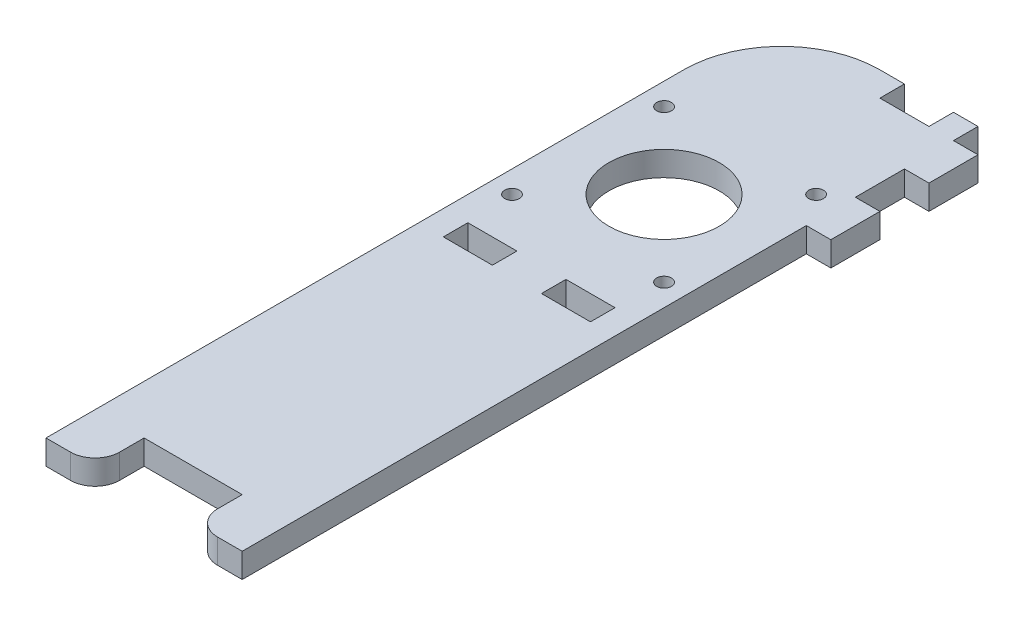
ISO-10303-21;
HEADER;
FILE_DESCRIPTION(('STEP AP214'),'2;1');
FILE_NAME('part.step','',(''),(''),'','','');
FILE_SCHEMA(('AUTOMOTIVE_DESIGN { 1 0 10303 214 1 1 1 1 }'));
ENDSEC;
DATA;
#1=APPLICATION_CONTEXT('core data for automotive mechanical design processes');
#2=APPLICATION_PROTOCOL_DEFINITION('international standard','automotive_design',2000,#1);
#3=PRODUCT_CONTEXT('',#1,'mechanical');
#4=PRODUCT('Part','Part','',(#3));
#5=PRODUCT_RELATED_PRODUCT_CATEGORY('part','',(#4));
#6=PRODUCT_DEFINITION_FORMATION('','',#4);
#7=PRODUCT_DEFINITION_CONTEXT('part definition',#1,'design');
#8=PRODUCT_DEFINITION('design','',#6,#7);
#9=PRODUCT_DEFINITION_SHAPE('','',#8);
#10=(LENGTH_UNIT() NAMED_UNIT(*) SI_UNIT(.MILLI.,.METRE.));
#11=(NAMED_UNIT(*) PLANE_ANGLE_UNIT() SI_UNIT($,.RADIAN.));
#12=(NAMED_UNIT(*) SI_UNIT($,.STERADIAN.) SOLID_ANGLE_UNIT());
#13=UNCERTAINTY_MEASURE_WITH_UNIT(LENGTH_MEASURE(1.E-05),#10,'distance_accuracy_value','');
#14=(GEOMETRIC_REPRESENTATION_CONTEXT(3) GLOBAL_UNCERTAINTY_ASSIGNED_CONTEXT((#13)) GLOBAL_UNIT_ASSIGNED_CONTEXT((#10,
#11,#12)) REPRESENTATION_CONTEXT('',''));
#15=CARTESIAN_POINT('',(0.,0.,0.));
#16=DIRECTION('',(0.,0.,1.));
#17=DIRECTION('',(1.,0.,0.));
#18=AXIS2_PLACEMENT_3D('',#15,#16,#17);
#19=CARTESIAN_POINT('',(20.,5.,-130.));
#20=DIRECTION('',(0.,-1.,0.));
#21=DIRECTION('',(0.,0.,-1.));
#22=AXIS2_PLACEMENT_3D('',#19,#20,#21);
#23=PLANE('',#22);
#24=DIRECTION('',(0.,0.,1.));
#25=VECTOR('',#24,1.);
#26=CARTESIAN_POINT('',(4.99999999999999,5.,-81.));
#27=LINE('',#26,#25);
#28=CARTESIAN_POINT('',(4.99999999999999,5.,-81.));
#29=VERTEX_POINT('',#28);
#30=CARTESIAN_POINT('',(4.99999999999999,5.,-76.));
#31=VERTEX_POINT('',#30);
#32=EDGE_CURVE('E277',#29,#31,#27,.T.);
#33=ORIENTED_EDGE('',*,*,#32,.F.);
#34=DIRECTION('',(-1.,0.,0.));
#35=VECTOR('',#34,1.);
#36=CARTESIAN_POINT('',(4.99999999999999,5.,-81.));
#37=LINE('',#36,#35);
#38=CARTESIAN_POINT('',(15.,5.,-81.));
#39=VERTEX_POINT('',#38);
#40=EDGE_CURVE('E285',#39,#29,#37,.T.);
#41=ORIENTED_EDGE('',*,*,#40,.F.);
#42=DIRECTION('',(0.,0.,-1.));
#43=VECTOR('',#42,1.);
#44=CARTESIAN_POINT('',(15.,5.,-81.));
#45=LINE('',#44,#43);
#46=CARTESIAN_POINT('',(15.,5.,-76.));
#47=VERTEX_POINT('',#46);
#48=EDGE_CURVE('E282',#47,#39,#45,.T.);
#49=ORIENTED_EDGE('',*,*,#48,.F.);
#50=DIRECTION('',(1.,0.,0.));
#51=VECTOR('',#50,1.);
#52=CARTESIAN_POINT('',(4.99999999999999,5.,-76.));
#53=LINE('',#52,#51);
#54=EDGE_CURVE('E279',#31,#47,#53,.T.);
#55=ORIENTED_EDGE('',*,*,#54,.F.);
#56=EDGE_LOOP('',(#33,#41,#49,#55));
#57=FACE_BOUND('',#56,.T.);
#58=DIRECTION('',(0.,0.,1.));
#59=VECTOR('',#58,1.);
#60=CARTESIAN_POINT('',(0.,5.,0.));
#61=LINE('',#60,#59);
#62=CARTESIAN_POINT('',(0.,5.,-130.));
#63=VERTEX_POINT('',#62);
#64=CARTESIAN_POINT('',(0.,5.,0.));
#65=VERTEX_POINT('',#64);
#66=EDGE_CURVE('E308',#63,#65,#61,.T.);
#67=ORIENTED_EDGE('',*,*,#66,.T.);
#68=DIRECTION('',(1.,0.,0.));
#69=VECTOR('',#68,1.);
#70=CARTESIAN_POINT('',(0.,5.,0.));
#71=LINE('',#70,#69);
#72=CARTESIAN_POINT('',(4.99999999999996,5.,0.));
#73=VERTEX_POINT('',#72);
#74=EDGE_CURVE('E311',#65,#73,#71,.T.);
#75=ORIENTED_EDGE('',*,*,#74,.T.);
#76=CARTESIAN_POINT('',(4.99999999999999,5.,-5.00000000000003));
#77=DIRECTION('',(0.,1.,0.));
#78=DIRECTION('',(0.,0.,-1.));
#79=AXIS2_PLACEMENT_3D('',#76,#77,#78);
#80=CIRCLE('',#79,5.);
#81=CARTESIAN_POINT('',(9.99999999999999,5.,-5.00000000000006));
#82=VERTEX_POINT('',#81);
#83=EDGE_CURVE('E314',#73,#82,#80,.T.);
#84=ORIENTED_EDGE('',*,*,#83,.T.);
#85=DIRECTION('',(0.,0.,-1.));
#86=VECTOR('',#85,1.);
#87=CARTESIAN_POINT('',(9.99999999999999,5.,-5.00000000000006));
#88=LINE('',#87,#86);
#89=CARTESIAN_POINT('',(9.99999999999999,5.,-10.));
#90=VERTEX_POINT('',#89);
#91=EDGE_CURVE('E316',#82,#90,#88,.T.);
#92=ORIENTED_EDGE('',*,*,#91,.T.);
#93=DIRECTION('',(1.,0.,0.));
#94=VECTOR('',#93,1.);
#95=CARTESIAN_POINT('',(9.99999999999999,5.,-10.));
#96=LINE('',#95,#94);
#97=CARTESIAN_POINT('',(30.,5.,-10.));
#98=VERTEX_POINT('',#97);
#99=EDGE_CURVE('E318',#90,#98,#96,.T.);
#100=ORIENTED_EDGE('',*,*,#99,.T.);
#101=DIRECTION('',(0.,0.,1.));
#102=VECTOR('',#101,1.);
#103=CARTESIAN_POINT('',(30.,5.,-10.));
#104=LINE('',#103,#102);
#105=CARTESIAN_POINT('',(30.,5.,-5.00000000000006));
#106=VERTEX_POINT('',#105);
#107=EDGE_CURVE('E320',#98,#106,#104,.T.);
#108=ORIENTED_EDGE('',*,*,#107,.T.);
#109=CARTESIAN_POINT('',(35.,5.,-5.00000000000003));
#110=DIRECTION('',(0.,1.,0.));
#111=DIRECTION('',(0.,0.,1.));
#112=AXIS2_PLACEMENT_3D('',#109,#110,#111);
#113=CIRCLE('',#112,5.);
#114=CARTESIAN_POINT('',(35.,5.,0.));
#115=VERTEX_POINT('',#114);
#116=EDGE_CURVE('E322',#106,#115,#113,.T.);
#117=ORIENTED_EDGE('',*,*,#116,.T.);
#118=DIRECTION('',(1.,0.,0.));
#119=VECTOR('',#118,1.);
#120=CARTESIAN_POINT('',(35.,5.,0.));
#121=LINE('',#120,#119);
#122=CARTESIAN_POINT('',(40.,5.,0.));
#123=VERTEX_POINT('',#122);
#124=EDGE_CURVE('E324',#115,#123,#121,.T.);
#125=ORIENTED_EDGE('',*,*,#124,.T.);
#126=DIRECTION('',(0.,0.,-1.));
#127=VECTOR('',#126,1.);
#128=CARTESIAN_POINT('',(40.,5.,0.));
#129=LINE('',#128,#127);
#130=CARTESIAN_POINT('',(40.,5.,-115.));
#131=VERTEX_POINT('',#130);
#132=EDGE_CURVE('E326',#123,#131,#129,.T.);
#133=ORIENTED_EDGE('',*,*,#132,.T.);
#134=DIRECTION('',(1.,0.,0.));
#135=VECTOR('',#134,1.);
#136=CARTESIAN_POINT('',(40.,5.,-115.));
#137=LINE('',#136,#135);
#138=CARTESIAN_POINT('',(45.,5.,-115.));
#139=VERTEX_POINT('',#138);
#140=EDGE_CURVE('E328',#131,#139,#137,.T.);
#141=ORIENTED_EDGE('',*,*,#140,.T.);
#142=DIRECTION('',(0.,0.,-1.));
#143=VECTOR('',#142,1.);
#144=CARTESIAN_POINT('',(45.,5.,-125.));
#145=LINE('',#144,#143);
#146=CARTESIAN_POINT('',(45.,5.,-125.));
#147=VERTEX_POINT('',#146);
#148=EDGE_CURVE('E330',#139,#147,#145,.T.);
#149=ORIENTED_EDGE('',*,*,#148,.T.);
#150=DIRECTION('',(-1.,0.,0.));
#151=VECTOR('',#150,1.);
#152=CARTESIAN_POINT('',(40.,5.,-125.));
#153=LINE('',#152,#151);
#154=CARTESIAN_POINT('',(40.,5.,-125.));
#155=VERTEX_POINT('',#154);
#156=EDGE_CURVE('E332',#147,#155,#153,.T.);
#157=ORIENTED_EDGE('',*,*,#156,.T.);
#158=DIRECTION('',(0.,0.,-1.));
#159=VECTOR('',#158,1.);
#160=CARTESIAN_POINT('',(40.,5.,-125.));
#161=LINE('',#160,#159);
#162=CARTESIAN_POINT('',(40.,5.,-135.));
#163=VERTEX_POINT('',#162);
#164=EDGE_CURVE('E334',#155,#163,#161,.T.);
#165=ORIENTED_EDGE('',*,*,#164,.T.);
#166=DIRECTION('',(1.,0.,0.));
#167=VECTOR('',#166,1.);
#168=CARTESIAN_POINT('',(40.,5.,-135.));
#169=LINE('',#168,#167);
#170=CARTESIAN_POINT('',(45.,5.,-135.));
#171=VERTEX_POINT('',#170);
#172=EDGE_CURVE('E336',#163,#171,#169,.T.);
#173=ORIENTED_EDGE('',*,*,#172,.T.);
#174=DIRECTION('',(0.,0.,-1.));
#175=VECTOR('',#174,1.);
#176=CARTESIAN_POINT('',(45.,5.,-145.));
#177=LINE('',#176,#175);
#178=CARTESIAN_POINT('',(45.,5.,-145.));
#179=VERTEX_POINT('',#178);
#180=EDGE_CURVE('E338',#171,#179,#177,.T.);
#181=ORIENTED_EDGE('',*,*,#180,.T.);
#182=DIRECTION('',(-1.,0.,0.));
#183=VECTOR('',#182,1.);
#184=CARTESIAN_POINT('',(40.,5.,-145.));
#185=LINE('',#184,#183);
#186=CARTESIAN_POINT('',(40.,5.,-145.));
#187=VERTEX_POINT('',#186);
#188=EDGE_CURVE('E340',#179,#187,#185,.T.);
#189=ORIENTED_EDGE('',*,*,#188,.T.);
#190=DIRECTION('',(0.,0.,-1.));
#191=VECTOR('',#190,1.);
#192=CARTESIAN_POINT('',(40.,5.,-145.));
#193=LINE('',#192,#191);
#194=CARTESIAN_POINT('',(40.,5.,-150.));
#195=VERTEX_POINT('',#194);
#196=EDGE_CURVE('E342',#187,#195,#193,.T.);
#197=ORIENTED_EDGE('',*,*,#196,.T.);
#198=DIRECTION('',(-1.,0.,0.));
#199=VECTOR('',#198,1.);
#200=CARTESIAN_POINT('',(35.,5.,-150.));
#201=LINE('',#200,#199);
#202=CARTESIAN_POINT('',(35.,5.,-150.));
#203=VERTEX_POINT('',#202);
#204=EDGE_CURVE('E344',#195,#203,#201,.T.);
#205=ORIENTED_EDGE('',*,*,#204,.T.);
#206=DIRECTION('',(0.,0.,1.));
#207=VECTOR('',#206,1.);
#208=CARTESIAN_POINT('',(35.,5.,-150.));
#209=LINE('',#208,#207);
#210=CARTESIAN_POINT('',(35.,5.,-145.));
#211=VERTEX_POINT('',#210);
#212=EDGE_CURVE('E346',#203,#211,#209,.T.);
#213=ORIENTED_EDGE('',*,*,#212,.T.);
#214=DIRECTION('',(-1.,0.,0.));
#215=VECTOR('',#214,1.);
#216=CARTESIAN_POINT('',(25.,5.,-145.));
#217=LINE('',#216,#215);
#218=CARTESIAN_POINT('',(25.,5.,-145.));
#219=VERTEX_POINT('',#218);
#220=EDGE_CURVE('E348',#211,#219,#217,.T.);
#221=ORIENTED_EDGE('',*,*,#220,.T.);
#222=DIRECTION('',(0.,0.,-1.));
#223=VECTOR('',#222,1.);
#224=CARTESIAN_POINT('',(25.,5.,-150.));
#225=LINE('',#224,#223);
#226=CARTESIAN_POINT('',(25.,5.,-150.));
#227=VERTEX_POINT('',#226);
#228=EDGE_CURVE('E350',#219,#227,#225,.T.);
#229=ORIENTED_EDGE('',*,*,#228,.T.);
#230=DIRECTION('',(-1.,0.,0.));
#231=VECTOR('',#230,1.);
#232=CARTESIAN_POINT('',(20.0000000000001,5.,-150.));
#233=LINE('',#232,#231);
#234=CARTESIAN_POINT('',(20.0000000000001,5.,-150.));
#235=VERTEX_POINT('',#234);
#236=EDGE_CURVE('E352',#227,#235,#233,.T.);
#237=ORIENTED_EDGE('',*,*,#236,.T.);
#238=CARTESIAN_POINT('',(20.,5.,-130.));
#239=DIRECTION('',(0.,1.,0.));
#240=DIRECTION('',(0.,0.,-1.));
#241=AXIS2_PLACEMENT_3D('',#238,#239,#240);
#242=CIRCLE('',#241,20.);
#243=EDGE_CURVE('E354',#235,#63,#242,.T.);
#244=ORIENTED_EDGE('',*,*,#243,.T.);
#245=EDGE_LOOP('',(#67,#75,#84,#92,#100,#108,#117,#125,#133,#141,#149,#157,#165,#173,#181,#189,
#197,#205,#213,#221,#229,#237,#244));
#246=FACE_BOUND('',#245,.T.);
#247=DIRECTION('',(0.,0.,1.));
#248=VECTOR('',#247,1.);
#249=CARTESIAN_POINT('',(25.,5.,-81.));
#250=LINE('',#249,#248);
#251=CARTESIAN_POINT('',(25.,5.,-81.));
#252=VERTEX_POINT('',#251);
#253=CARTESIAN_POINT('',(25.,5.,-76.));
#254=VERTEX_POINT('',#253);
#255=EDGE_CURVE('E238',#252,#254,#250,.T.);
#256=ORIENTED_EDGE('',*,*,#255,.F.);
#257=DIRECTION('',(-1.,0.,0.));
#258=VECTOR('',#257,1.);
#259=CARTESIAN_POINT('',(25.,5.,-81.));
#260=LINE('',#259,#258);
#261=CARTESIAN_POINT('',(35.,5.,-81.));
#262=VERTEX_POINT('',#261);
#263=EDGE_CURVE('E261',#262,#252,#260,.T.);
#264=ORIENTED_EDGE('',*,*,#263,.F.);
#265=DIRECTION('',(0.,0.,-1.));
#266=VECTOR('',#265,1.);
#267=CARTESIAN_POINT('',(35.,5.,-81.));
#268=LINE('',#267,#266);
#269=CARTESIAN_POINT('',(35.,5.,-76.));
#270=VERTEX_POINT('',#269);
#271=EDGE_CURVE('E259',#270,#262,#268,.T.);
#272=ORIENTED_EDGE('',*,*,#271,.F.);
#273=DIRECTION('',(1.,0.,0.));
#274=VECTOR('',#273,1.);
#275=CARTESIAN_POINT('',(25.,5.,-76.));
#276=LINE('',#275,#274);
#277=EDGE_CURVE('E246',#254,#270,#276,.T.);
#278=ORIENTED_EDGE('',*,*,#277,.F.);
#279=EDGE_LOOP('',(#256,#264,#272,#278));
#280=FACE_BOUND('',#279,.T.);
#281=CARTESIAN_POINT('',(20.,5.,-106.));
#282=DIRECTION('',(0.,1.,0.));
#283=DIRECTION('',(0.,0.,1.));
#284=AXIS2_PLACEMENT_3D('',#281,#282,#283);
#285=CIRCLE('',#284,11.25);
#286=CARTESIAN_POINT('',(20.,5.,-94.75));
#287=VERTEX_POINT('',#286);
#288=EDGE_CURVE('E267',#287,#287,#285,.T.);
#289=ORIENTED_EDGE('',*,*,#288,.F.);
#290=EDGE_LOOP('',(#289));
#291=FACE_BOUND('',#290,.T.);
#292=CARTESIAN_POINT('',(4.5,5.,-121.5));
#293=DIRECTION('',(0.,1.,0.));
#294=DIRECTION('',(0.,0.,1.));
#295=AXIS2_PLACEMENT_3D('',#292,#293,#294);
#296=CIRCLE('',#295,1.5);
#297=CARTESIAN_POINT('',(4.5,5.,-120.));
#298=VERTEX_POINT('',#297);
#299=EDGE_CURVE('E930',#298,#298,#296,.T.);
#300=ORIENTED_EDGE('',*,*,#299,.F.);
#301=EDGE_LOOP('',(#300));
#302=FACE_BOUND('',#301,.T.);
#303=CARTESIAN_POINT('',(35.5,5.,-121.5));
#304=DIRECTION('',(0.,1.,0.));
#305=DIRECTION('',(0.,0.,1.));
#306=AXIS2_PLACEMENT_3D('',#303,#304,#305);
#307=CIRCLE('',#306,1.5);
#308=CARTESIAN_POINT('',(35.5,5.,-120.));
#309=VERTEX_POINT('',#308);
#310=EDGE_CURVE('E924',#309,#309,#307,.T.);
#311=ORIENTED_EDGE('',*,*,#310,.F.);
#312=EDGE_LOOP('',(#311));
#313=FACE_BOUND('',#312,.T.);
#314=CARTESIAN_POINT('',(4.5,5.,-90.5));
#315=DIRECTION('',(0.,1.,0.));
#316=DIRECTION('',(0.,0.,1.));
#317=AXIS2_PLACEMENT_3D('',#314,#315,#316);
#318=CIRCLE('',#317,1.5);
#319=CARTESIAN_POINT('',(4.5,5.,-89.));
#320=VERTEX_POINT('',#319);
#321=EDGE_CURVE('E918',#320,#320,#318,.T.);
#322=ORIENTED_EDGE('',*,*,#321,.F.);
#323=EDGE_LOOP('',(#322));
#324=FACE_BOUND('',#323,.T.);
#325=CARTESIAN_POINT('',(35.5,5.,-90.5));
#326=DIRECTION('',(0.,1.,0.));
#327=DIRECTION('',(0.,0.,1.));
#328=AXIS2_PLACEMENT_3D('',#325,#326,#327);
#329=CIRCLE('',#328,1.5);
#330=CARTESIAN_POINT('',(35.5,5.,-89.));
#331=VERTEX_POINT('',#330);
#332=EDGE_CURVE('E909',#331,#331,#329,.T.);
#333=ORIENTED_EDGE('',*,*,#332,.F.);
#334=EDGE_LOOP('',(#333));
#335=FACE_BOUND('',#334,.T.);
#336=ADVANCED_FACE('F35',(#57,#246,#280,#291,#302,#313,#324,#335),#23,.F.);
#337=CARTESIAN_POINT('',(20.,0.,-130.));
#338=DIRECTION('',(0.,-1.,0.));
#339=DIRECTION('',(0.,0.,-1.));
#340=AXIS2_PLACEMENT_3D('',#337,#338,#339);
#341=PLANE('',#340);
#342=CARTESIAN_POINT('',(4.5,0.,-90.5));
#343=DIRECTION('',(0.,1.,0.));
#344=DIRECTION('',(0.,0.,1.));
#345=AXIS2_PLACEMENT_3D('',#342,#343,#344);
#346=CIRCLE('',#345,1.5);
#347=CARTESIAN_POINT('',(4.5,0.,-89.));
#348=VERTEX_POINT('',#347);
#349=EDGE_CURVE('E915',#348,#348,#346,.T.);
#350=ORIENTED_EDGE('',*,*,#349,.T.);
#351=EDGE_LOOP('',(#350));
#352=FACE_BOUND('',#351,.T.);
#353=CARTESIAN_POINT('',(4.5,0.,-121.5));
#354=DIRECTION('',(0.,1.,0.));
#355=DIRECTION('',(0.,0.,1.));
#356=AXIS2_PLACEMENT_3D('',#353,#354,#355);
#357=CIRCLE('',#356,1.5);
#358=CARTESIAN_POINT('',(4.5,0.,-120.));
#359=VERTEX_POINT('',#358);
#360=EDGE_CURVE('E927',#359,#359,#357,.T.);
#361=ORIENTED_EDGE('',*,*,#360,.T.);
#362=EDGE_LOOP('',(#361));
#363=FACE_BOUND('',#362,.T.);
#364=DIRECTION('',(-1.,0.,0.));
#365=VECTOR('',#364,1.);
#366=CARTESIAN_POINT('',(25.,0.,-81.));
#367=LINE('',#366,#365);
#368=CARTESIAN_POINT('',(35.,0.,-81.));
#369=VERTEX_POINT('',#368);
#370=CARTESIAN_POINT('',(25.,0.,-81.));
#371=VERTEX_POINT('',#370);
#372=EDGE_CURVE('E247',#369,#371,#367,.T.);
#373=ORIENTED_EDGE('',*,*,#372,.T.);
#374=DIRECTION('',(0.,0.,1.));
#375=VECTOR('',#374,1.);
#376=CARTESIAN_POINT('',(25.,0.,-81.));
#377=LINE('',#376,#375);
#378=CARTESIAN_POINT('',(25.,0.,-76.));
#379=VERTEX_POINT('',#378);
#380=EDGE_CURVE('E58',#371,#379,#377,.T.);
#381=ORIENTED_EDGE('',*,*,#380,.T.);
#382=DIRECTION('',(1.,0.,0.));
#383=VECTOR('',#382,1.);
#384=CARTESIAN_POINT('',(25.,0.,-76.));
#385=LINE('',#384,#383);
#386=CARTESIAN_POINT('',(35.,0.,-76.));
#387=VERTEX_POINT('',#386);
#388=EDGE_CURVE('E253',#379,#387,#385,.T.);
#389=ORIENTED_EDGE('',*,*,#388,.T.);
#390=DIRECTION('',(0.,0.,-1.));
#391=VECTOR('',#390,1.);
#392=CARTESIAN_POINT('',(35.,0.,-81.));
#393=LINE('',#392,#391);
#394=EDGE_CURVE('E269',#387,#369,#393,.T.);
#395=ORIENTED_EDGE('',*,*,#394,.T.);
#396=EDGE_LOOP('',(#373,#381,#389,#395));
#397=FACE_BOUND('',#396,.T.);
#398=DIRECTION('',(-1.,0.,0.));
#399=VECTOR('',#398,1.);
#400=CARTESIAN_POINT('',(4.99999999999999,0.,-81.));
#401=LINE('',#400,#399);
#402=CARTESIAN_POINT('',(15.,0.,-81.));
#403=VERTEX_POINT('',#402);
#404=CARTESIAN_POINT('',(4.99999999999999,0.,-81.));
#405=VERTEX_POINT('',#404);
#406=EDGE_CURVE('E280',#403,#405,#401,.T.);
#407=ORIENTED_EDGE('',*,*,#406,.T.);
#408=DIRECTION('',(0.,0.,1.));
#409=VECTOR('',#408,1.);
#410=CARTESIAN_POINT('',(4.99999999999999,0.,-81.));
#411=LINE('',#410,#409);
#412=CARTESIAN_POINT('',(4.99999999999999,0.,-76.));
#413=VERTEX_POINT('',#412);
#414=EDGE_CURVE('E254',#405,#413,#411,.T.);
#415=ORIENTED_EDGE('',*,*,#414,.T.);
#416=DIRECTION('',(1.,0.,0.));
#417=VECTOR('',#416,1.);
#418=CARTESIAN_POINT('',(4.99999999999999,0.,-76.));
#419=LINE('',#418,#417);
#420=CARTESIAN_POINT('',(15.,0.,-76.));
#421=VERTEX_POINT('',#420);
#422=EDGE_CURVE('E290',#413,#421,#419,.T.);
#423=ORIENTED_EDGE('',*,*,#422,.T.);
#424=DIRECTION('',(0.,0.,-1.));
#425=VECTOR('',#424,1.);
#426=CARTESIAN_POINT('',(15.,0.,-81.));
#427=LINE('',#426,#425);
#428=EDGE_CURVE('E293',#421,#403,#427,.T.);
#429=ORIENTED_EDGE('',*,*,#428,.T.);
#430=EDGE_LOOP('',(#407,#415,#423,#429));
#431=FACE_BOUND('',#430,.T.);
#432=DIRECTION('',(0.,0.,1.));
#433=VECTOR('',#432,1.);
#434=CARTESIAN_POINT('',(0.,0.,0.));
#435=LINE('',#434,#433);
#436=CARTESIAN_POINT('',(0.,0.,-130.));
#437=VERTEX_POINT('',#436);
#438=CARTESIAN_POINT('',(0.,0.,0.));
#439=VERTEX_POINT('',#438);
#440=EDGE_CURVE('E307',#437,#439,#435,.T.);
#441=ORIENTED_EDGE('',*,*,#440,.F.);
#442=CARTESIAN_POINT('',(20.,0.,-130.));
#443=DIRECTION('',(0.,1.,0.));
#444=DIRECTION('',(0.,0.,-1.));
#445=AXIS2_PLACEMENT_3D('',#442,#443,#444);
#446=CIRCLE('',#445,20.);
#447=CARTESIAN_POINT('',(20.0000000000001,0.,-150.));
#448=VERTEX_POINT('',#447);
#449=EDGE_CURVE('E312',#448,#437,#446,.T.);
#450=ORIENTED_EDGE('',*,*,#449,.F.);
#451=DIRECTION('',(-1.,0.,0.));
#452=VECTOR('',#451,1.);
#453=CARTESIAN_POINT('',(20.0000000000001,0.,-150.));
#454=LINE('',#453,#452);
#455=CARTESIAN_POINT('',(25.,0.,-150.));
#456=VERTEX_POINT('',#455);
#457=EDGE_CURVE('E399',#456,#448,#454,.T.);
#458=ORIENTED_EDGE('',*,*,#457,.F.);
#459=DIRECTION('',(0.,0.,-1.));
#460=VECTOR('',#459,1.);
#461=CARTESIAN_POINT('',(25.,0.,-150.));
#462=LINE('',#461,#460);
#463=CARTESIAN_POINT('',(25.,0.,-145.));
#464=VERTEX_POINT('',#463);
#465=EDGE_CURVE('E397',#464,#456,#462,.T.);
#466=ORIENTED_EDGE('',*,*,#465,.F.);
#467=DIRECTION('',(-1.,0.,0.));
#468=VECTOR('',#467,1.);
#469=CARTESIAN_POINT('',(25.,0.,-145.));
#470=LINE('',#469,#468);
#471=CARTESIAN_POINT('',(35.,0.,-145.));
#472=VERTEX_POINT('',#471);
#473=EDGE_CURVE('E395',#472,#464,#470,.T.);
#474=ORIENTED_EDGE('',*,*,#473,.F.);
#475=DIRECTION('',(0.,0.,1.));
#476=VECTOR('',#475,1.);
#477=CARTESIAN_POINT('',(35.,0.,-150.));
#478=LINE('',#477,#476);
#479=CARTESIAN_POINT('',(35.,0.,-150.));
#480=VERTEX_POINT('',#479);
#481=EDGE_CURVE('E393',#480,#472,#478,.T.);
#482=ORIENTED_EDGE('',*,*,#481,.F.);
#483=DIRECTION('',(-1.,0.,0.));
#484=VECTOR('',#483,1.);
#485=CARTESIAN_POINT('',(35.,0.,-150.));
#486=LINE('',#485,#484);
#487=CARTESIAN_POINT('',(40.,0.,-150.));
#488=VERTEX_POINT('',#487);
#489=EDGE_CURVE('E391',#488,#480,#486,.T.);
#490=ORIENTED_EDGE('',*,*,#489,.F.);
#491=DIRECTION('',(0.,0.,-1.));
#492=VECTOR('',#491,1.);
#493=CARTESIAN_POINT('',(40.,0.,-145.));
#494=LINE('',#493,#492);
#495=CARTESIAN_POINT('',(40.,0.,-145.));
#496=VERTEX_POINT('',#495);
#497=EDGE_CURVE('E389',#496,#488,#494,.T.);
#498=ORIENTED_EDGE('',*,*,#497,.F.);
#499=DIRECTION('',(-1.,0.,0.));
#500=VECTOR('',#499,1.);
#501=CARTESIAN_POINT('',(40.,0.,-145.));
#502=LINE('',#501,#500);
#503=CARTESIAN_POINT('',(45.,0.,-145.));
#504=VERTEX_POINT('',#503);
#505=EDGE_CURVE('E387',#504,#496,#502,.T.);
#506=ORIENTED_EDGE('',*,*,#505,.F.);
#507=DIRECTION('',(0.,0.,-1.));
#508=VECTOR('',#507,1.);
#509=CARTESIAN_POINT('',(45.,0.,-145.));
#510=LINE('',#509,#508);
#511=CARTESIAN_POINT('',(45.,0.,-135.));
#512=VERTEX_POINT('',#511);
#513=EDGE_CURVE('E385',#512,#504,#510,.T.);
#514=ORIENTED_EDGE('',*,*,#513,.F.);
#515=DIRECTION('',(1.,0.,0.));
#516=VECTOR('',#515,1.);
#517=CARTESIAN_POINT('',(40.,0.,-135.));
#518=LINE('',#517,#516);
#519=CARTESIAN_POINT('',(40.,0.,-135.));
#520=VERTEX_POINT('',#519);
#521=EDGE_CURVE('E383',#520,#512,#518,.T.);
#522=ORIENTED_EDGE('',*,*,#521,.F.);
#523=DIRECTION('',(0.,0.,-1.));
#524=VECTOR('',#523,1.);
#525=CARTESIAN_POINT('',(40.,0.,-125.));
#526=LINE('',#525,#524);
#527=CARTESIAN_POINT('',(40.,0.,-125.));
#528=VERTEX_POINT('',#527);
#529=EDGE_CURVE('E381',#528,#520,#526,.T.);
#530=ORIENTED_EDGE('',*,*,#529,.F.);
#531=DIRECTION('',(-1.,0.,0.));
#532=VECTOR('',#531,1.);
#533=CARTESIAN_POINT('',(40.,0.,-125.));
#534=LINE('',#533,#532);
#535=CARTESIAN_POINT('',(45.,0.,-125.));
#536=VERTEX_POINT('',#535);
#537=EDGE_CURVE('E379',#536,#528,#534,.T.);
#538=ORIENTED_EDGE('',*,*,#537,.F.);
#539=DIRECTION('',(0.,0.,-1.));
#540=VECTOR('',#539,1.);
#541=CARTESIAN_POINT('',(45.,0.,-125.));
#542=LINE('',#541,#540);
#543=CARTESIAN_POINT('',(45.,0.,-115.));
#544=VERTEX_POINT('',#543);
#545=EDGE_CURVE('E377',#544,#536,#542,.T.);
#546=ORIENTED_EDGE('',*,*,#545,.F.);
#547=DIRECTION('',(1.,0.,0.));
#548=VECTOR('',#547,1.);
#549=CARTESIAN_POINT('',(40.,0.,-115.));
#550=LINE('',#549,#548);
#551=CARTESIAN_POINT('',(40.,0.,-115.));
#552=VERTEX_POINT('',#551);
#553=EDGE_CURVE('E375',#552,#544,#550,.T.);
#554=ORIENTED_EDGE('',*,*,#553,.F.);
#555=DIRECTION('',(0.,0.,-1.));
#556=VECTOR('',#555,1.);
#557=CARTESIAN_POINT('',(40.,0.,0.));
#558=LINE('',#557,#556);
#559=CARTESIAN_POINT('',(40.,0.,0.));
#560=VERTEX_POINT('',#559);
#561=EDGE_CURVE('E373',#560,#552,#558,.T.);
#562=ORIENTED_EDGE('',*,*,#561,.F.);
#563=DIRECTION('',(1.,0.,0.));
#564=VECTOR('',#563,1.);
#565=CARTESIAN_POINT('',(35.,0.,0.));
#566=LINE('',#565,#564);
#567=CARTESIAN_POINT('',(35.,0.,0.));
#568=VERTEX_POINT('',#567);
#569=EDGE_CURVE('E371',#568,#560,#566,.T.);
#570=ORIENTED_EDGE('',*,*,#569,.F.);
#571=CARTESIAN_POINT('',(35.,0.,-5.00000000000003));
#572=DIRECTION('',(0.,1.,0.));
#573=DIRECTION('',(0.,0.,1.));
#574=AXIS2_PLACEMENT_3D('',#571,#572,#573);
#575=CIRCLE('',#574,5.);
#576=CARTESIAN_POINT('',(30.,0.,-5.00000000000006));
#577=VERTEX_POINT('',#576);
#578=EDGE_CURVE('E369',#577,#568,#575,.T.);
#579=ORIENTED_EDGE('',*,*,#578,.F.);
#580=DIRECTION('',(0.,0.,1.));
#581=VECTOR('',#580,1.);
#582=CARTESIAN_POINT('',(30.,0.,-10.));
#583=LINE('',#582,#581);
#584=CARTESIAN_POINT('',(30.,0.,-10.));
#585=VERTEX_POINT('',#584);
#586=EDGE_CURVE('E367',#585,#577,#583,.T.);
#587=ORIENTED_EDGE('',*,*,#586,.F.);
#588=DIRECTION('',(1.,0.,0.));
#589=VECTOR('',#588,1.);
#590=CARTESIAN_POINT('',(9.99999999999999,0.,-10.));
#591=LINE('',#590,#589);
#592=CARTESIAN_POINT('',(9.99999999999999,0.,-10.));
#593=VERTEX_POINT('',#592);
#594=EDGE_CURVE('E365',#593,#585,#591,.T.);
#595=ORIENTED_EDGE('',*,*,#594,.F.);
#596=DIRECTION('',(0.,0.,-1.));
#597=VECTOR('',#596,1.);
#598=CARTESIAN_POINT('',(9.99999999999999,0.,-5.00000000000006));
#599=LINE('',#598,#597);
#600=CARTESIAN_POINT('',(9.99999999999999,0.,-5.00000000000006));
#601=VERTEX_POINT('',#600);
#602=EDGE_CURVE('E363',#601,#593,#599,.T.);
#603=ORIENTED_EDGE('',*,*,#602,.F.);
#604=CARTESIAN_POINT('',(4.99999999999999,0.,-5.00000000000003));
#605=DIRECTION('',(0.,1.,0.));
#606=DIRECTION('',(0.,0.,-1.));
#607=AXIS2_PLACEMENT_3D('',#604,#605,#606);
#608=CIRCLE('',#607,5.);
#609=CARTESIAN_POINT('',(4.99999999999996,0.,0.));
#610=VERTEX_POINT('',#609);
#611=EDGE_CURVE('E361',#610,#601,#608,.T.);
#612=ORIENTED_EDGE('',*,*,#611,.F.);
#613=DIRECTION('',(1.,0.,0.));
#614=VECTOR('',#613,1.);
#615=CARTESIAN_POINT('',(0.,0.,0.));
#616=LINE('',#615,#614);
#617=EDGE_CURVE('E359',#439,#610,#616,.T.);
#618=ORIENTED_EDGE('',*,*,#617,.F.);
#619=EDGE_LOOP('',(#441,#450,#458,#466,#474,#482,#490,#498,#506,#514,#522,#530,#538,#546,#554,
#562,#570,#579,#587,#595,#603,#612,#618));
#620=FACE_BOUND('',#619,.T.);
#621=CARTESIAN_POINT('',(20.,0.,-106.));
#622=DIRECTION('',(0.,1.,0.));
#623=DIRECTION('',(0.,0.,1.));
#624=AXIS2_PLACEMENT_3D('',#621,#622,#623);
#625=CIRCLE('',#624,11.25);
#626=CARTESIAN_POINT('',(20.,0.,-94.75));
#627=VERTEX_POINT('',#626);
#628=EDGE_CURVE('E933',#627,#627,#625,.T.);
#629=ORIENTED_EDGE('',*,*,#628,.T.);
#630=EDGE_LOOP('',(#629));
#631=FACE_BOUND('',#630,.T.);
#632=CARTESIAN_POINT('',(35.5,0.,-121.5));
#633=DIRECTION('',(0.,1.,0.));
#634=DIRECTION('',(0.,0.,1.));
#635=AXIS2_PLACEMENT_3D('',#632,#633,#634);
#636=CIRCLE('',#635,1.5);
#637=CARTESIAN_POINT('',(35.5,0.,-120.));
#638=VERTEX_POINT('',#637);
#639=EDGE_CURVE('E921',#638,#638,#636,.T.);
#640=ORIENTED_EDGE('',*,*,#639,.T.);
#641=EDGE_LOOP('',(#640));
#642=FACE_BOUND('',#641,.T.);
#643=CARTESIAN_POINT('',(35.5,0.,-90.5));
#644=DIRECTION('',(0.,1.,0.));
#645=DIRECTION('',(0.,0.,1.));
#646=AXIS2_PLACEMENT_3D('',#643,#644,#645);
#647=CIRCLE('',#646,1.5);
#648=CARTESIAN_POINT('',(35.5,0.,-89.));
#649=VERTEX_POINT('',#648);
#650=EDGE_CURVE('E912',#649,#649,#647,.T.);
#651=ORIENTED_EDGE('',*,*,#650,.T.);
#652=EDGE_LOOP('',(#651));
#653=FACE_BOUND('',#652,.T.);
#654=ADVANCED_FACE('F474',(#352,#363,#397,#431,#620,#631,#642,#653),#341,.T.);
#655=CARTESIAN_POINT('',(0.,5.,0.));
#656=DIRECTION('',(1.,0.,0.));
#657=DIRECTION('',(0.,0.,-1.));
#658=AXIS2_PLACEMENT_3D('',#655,#656,#657);
#659=PLANE('',#658);
#660=ORIENTED_EDGE('',*,*,#440,.T.);
#661=DIRECTION('',(0.,-1.,0.));
#662=VECTOR('',#661,1.);
#663=CARTESIAN_POINT('',(0.,5.,0.));
#664=LINE('',#663,#662);
#665=EDGE_CURVE('E11',#65,#439,#664,.T.);
#666=ORIENTED_EDGE('',*,*,#665,.F.);
#667=ORIENTED_EDGE('',*,*,#66,.F.);
#668=DIRECTION('',(0.,-1.,0.));
#669=VECTOR('',#668,1.);
#670=CARTESIAN_POINT('',(0.,5.,-130.));
#671=LINE('',#670,#669);
#672=EDGE_CURVE('E356',#63,#437,#671,.T.);
#673=ORIENTED_EDGE('',*,*,#672,.T.);
#674=EDGE_LOOP('',(#660,#666,#667,#673));
#675=FACE_BOUND('',#674,.T.);
#676=ADVANCED_FACE('F37',(#675),#659,.F.);
#677=CARTESIAN_POINT('',(0.,5.,0.));
#678=DIRECTION('',(0.,0.,-1.));
#679=DIRECTION('',(-1.,0.,0.));
#680=AXIS2_PLACEMENT_3D('',#677,#678,#679);
#681=PLANE('',#680);
#682=ORIENTED_EDGE('',*,*,#617,.T.);
#683=DIRECTION('',(0.,-1.,0.));
#684=VECTOR('',#683,1.);
#685=CARTESIAN_POINT('',(4.99999999999996,5.,0.));
#686=LINE('',#685,#684);
#687=EDGE_CURVE('E43',#73,#610,#686,.T.);
#688=ORIENTED_EDGE('',*,*,#687,.F.);
#689=ORIENTED_EDGE('',*,*,#74,.F.);
#690=ORIENTED_EDGE('',*,*,#665,.T.);
#691=EDGE_LOOP('',(#682,#688,#689,#690));
#692=FACE_BOUND('',#691,.T.);
#693=ADVANCED_FACE('F491',(#692),#681,.F.);
#694=CARTESIAN_POINT('',(4.99999999999999,5.,-5.00000000000003));
#695=DIRECTION('',(0.,-1.,0.));
#696=DIRECTION('',(0.,0.,-1.));
#697=AXIS2_PLACEMENT_3D('',#694,#695,#696);
#698=CYLINDRICAL_SURFACE('',#697,5.);
#699=ORIENTED_EDGE('',*,*,#611,.T.);
#700=DIRECTION('',(0.,-1.,0.));
#701=VECTOR('',#700,1.);
#702=CARTESIAN_POINT('',(9.99999999999999,5.,-5.00000000000006));
#703=LINE('',#702,#701);
#704=EDGE_CURVE('E461',#82,#601,#703,.T.);
#705=ORIENTED_EDGE('',*,*,#704,.F.);
#706=ORIENTED_EDGE('',*,*,#83,.F.);
#707=ORIENTED_EDGE('',*,*,#687,.T.);
#708=EDGE_LOOP('',(#699,#705,#706,#707));
#709=FACE_BOUND('',#708,.T.);
#710=ADVANCED_FACE('F468',(#709),#698,.T.);
#711=CARTESIAN_POINT('',(9.99999999999999,5.,-5.00000000000006));
#712=DIRECTION('',(-1.,0.,0.));
#713=DIRECTION('',(0.,0.,1.));
#714=AXIS2_PLACEMENT_3D('',#711,#712,#713);
#715=PLANE('',#714);
#716=ORIENTED_EDGE('',*,*,#602,.T.);
#717=DIRECTION('',(0.,-1.,0.));
#718=VECTOR('',#717,1.);
#719=CARTESIAN_POINT('',(9.99999999999999,5.,-10.));
#720=LINE('',#719,#718);
#721=EDGE_CURVE('E458',#90,#593,#720,.T.);
#722=ORIENTED_EDGE('',*,*,#721,.F.);
#723=ORIENTED_EDGE('',*,*,#91,.F.);
#724=ORIENTED_EDGE('',*,*,#704,.T.);
#725=EDGE_LOOP('',(#716,#722,#723,#724));
#726=FACE_BOUND('',#725,.T.);
#727=ADVANCED_FACE('F480',(#726),#715,.F.);
#728=CARTESIAN_POINT('',(9.99999999999999,5.,-10.));
#729=DIRECTION('',(0.,0.,-1.));
#730=DIRECTION('',(-1.,0.,0.));
#731=AXIS2_PLACEMENT_3D('',#728,#729,#730);
#732=PLANE('',#731);
#733=ORIENTED_EDGE('',*,*,#594,.T.);
#734=DIRECTION('',(0.,-1.,0.));
#735=VECTOR('',#734,1.);
#736=CARTESIAN_POINT('',(30.,5.,-10.));
#737=LINE('',#736,#735);
#738=EDGE_CURVE('E455',#98,#585,#737,.T.);
#739=ORIENTED_EDGE('',*,*,#738,.F.);
#740=ORIENTED_EDGE('',*,*,#99,.F.);
#741=ORIENTED_EDGE('',*,*,#721,.T.);
#742=EDGE_LOOP('',(#733,#739,#740,#741));
#743=FACE_BOUND('',#742,.T.);
#744=ADVANCED_FACE('F484',(#743),#732,.F.);
#745=CARTESIAN_POINT('',(30.,5.,-10.));
#746=DIRECTION('',(1.,0.,0.));
#747=DIRECTION('',(0.,0.,-1.));
#748=AXIS2_PLACEMENT_3D('',#745,#746,#747);
#749=PLANE('',#748);
#750=ORIENTED_EDGE('',*,*,#586,.T.);
#751=DIRECTION('',(0.,-1.,0.));
#752=VECTOR('',#751,1.);
#753=CARTESIAN_POINT('',(30.,5.,-5.00000000000006));
#754=LINE('',#753,#752);
#755=EDGE_CURVE('E452',#106,#577,#754,.T.);
#756=ORIENTED_EDGE('',*,*,#755,.F.);
#757=ORIENTED_EDGE('',*,*,#107,.F.);
#758=ORIENTED_EDGE('',*,*,#738,.T.);
#759=EDGE_LOOP('',(#750,#756,#757,#758));
#760=FACE_BOUND('',#759,.T.);
#761=ADVANCED_FACE('F579',(#760),#749,.F.);
#762=CARTESIAN_POINT('',(35.,5.,-5.00000000000003));
#763=DIRECTION('',(0.,-1.,0.));
#764=DIRECTION('',(0.,0.,-1.));
#765=AXIS2_PLACEMENT_3D('',#762,#763,#764);
#766=CYLINDRICAL_SURFACE('',#765,5.);
#767=ORIENTED_EDGE('',*,*,#578,.T.);
#768=DIRECTION('',(0.,-1.,0.));
#769=VECTOR('',#768,1.);
#770=CARTESIAN_POINT('',(35.,5.,0.));
#771=LINE('',#770,#769);
#772=EDGE_CURVE('E449',#115,#568,#771,.T.);
#773=ORIENTED_EDGE('',*,*,#772,.F.);
#774=ORIENTED_EDGE('',*,*,#116,.F.);
#775=ORIENTED_EDGE('',*,*,#755,.T.);
#776=EDGE_LOOP('',(#767,#773,#774,#775));
#777=FACE_BOUND('',#776,.T.);
#778=ADVANCED_FACE('F577',(#777),#766,.T.);
#779=CARTESIAN_POINT('',(35.,5.,0.));
#780=DIRECTION('',(0.,0.,-1.));
#781=DIRECTION('',(-1.,0.,0.));
#782=AXIS2_PLACEMENT_3D('',#779,#780,#781);
#783=PLANE('',#782);
#784=ORIENTED_EDGE('',*,*,#569,.T.);
#785=DIRECTION('',(0.,-1.,0.));
#786=VECTOR('',#785,1.);
#787=CARTESIAN_POINT('',(40.,5.,0.));
#788=LINE('',#787,#786);
#789=EDGE_CURVE('E446',#123,#560,#788,.T.);
#790=ORIENTED_EDGE('',*,*,#789,.F.);
#791=ORIENTED_EDGE('',*,*,#124,.F.);
#792=ORIENTED_EDGE('',*,*,#772,.T.);
#793=EDGE_LOOP('',(#784,#790,#791,#792));
#794=FACE_BOUND('',#793,.T.);
#795=ADVANCED_FACE('F572',(#794),#783,.F.);
#796=CARTESIAN_POINT('',(40.,5.,0.));
#797=DIRECTION('',(-1.,0.,0.));
#798=DIRECTION('',(0.,0.,1.));
#799=AXIS2_PLACEMENT_3D('',#796,#797,#798);
#800=PLANE('',#799);
#801=ORIENTED_EDGE('',*,*,#561,.T.);
#802=DIRECTION('',(0.,-1.,0.));
#803=VECTOR('',#802,1.);
#804=CARTESIAN_POINT('',(40.,5.,-115.));
#805=LINE('',#804,#803);
#806=EDGE_CURVE('E443',#131,#552,#805,.T.);
#807=ORIENTED_EDGE('',*,*,#806,.F.);
#808=ORIENTED_EDGE('',*,*,#132,.F.);
#809=ORIENTED_EDGE('',*,*,#789,.T.);
#810=EDGE_LOOP('',(#801,#807,#808,#809));
#811=FACE_BOUND('',#810,.T.);
#812=ADVANCED_FACE('F567',(#811),#800,.F.);
#813=CARTESIAN_POINT('',(40.,5.,-115.));
#814=DIRECTION('',(0.,0.,-1.));
#815=DIRECTION('',(-1.,0.,0.));
#816=AXIS2_PLACEMENT_3D('',#813,#814,#815);
#817=PLANE('',#816);
#818=ORIENTED_EDGE('',*,*,#553,.T.);
#819=DIRECTION('',(0.,-1.,0.));
#820=VECTOR('',#819,1.);
#821=CARTESIAN_POINT('',(45.,5.,-115.));
#822=LINE('',#821,#820);
#823=EDGE_CURVE('E440',#139,#544,#822,.T.);
#824=ORIENTED_EDGE('',*,*,#823,.F.);
#825=ORIENTED_EDGE('',*,*,#140,.F.);
#826=ORIENTED_EDGE('',*,*,#806,.T.);
#827=EDGE_LOOP('',(#818,#824,#825,#826));
#828=FACE_BOUND('',#827,.T.);
#829=ADVANCED_FACE('F563',(#828),#817,.F.);
#830=CARTESIAN_POINT('',(45.,5.,-125.));
#831=DIRECTION('',(-1.,0.,0.));
#832=DIRECTION('',(0.,0.,1.));
#833=AXIS2_PLACEMENT_3D('',#830,#831,#832);
#834=PLANE('',#833);
#835=ORIENTED_EDGE('',*,*,#545,.T.);
#836=DIRECTION('',(0.,-1.,0.));
#837=VECTOR('',#836,1.);
#838=CARTESIAN_POINT('',(45.,5.,-125.));
#839=LINE('',#838,#837);
#840=EDGE_CURVE('E437',#147,#536,#839,.T.);
#841=ORIENTED_EDGE('',*,*,#840,.F.);
#842=ORIENTED_EDGE('',*,*,#148,.F.);
#843=ORIENTED_EDGE('',*,*,#823,.T.);
#844=EDGE_LOOP('',(#835,#841,#842,#843));
#845=FACE_BOUND('',#844,.T.);
#846=ADVANCED_FACE('F558',(#845),#834,.F.);
#847=CARTESIAN_POINT('',(40.,5.,-125.));
#848=DIRECTION('',(0.,0.,1.));
#849=DIRECTION('',(1.,0.,0.));
#850=AXIS2_PLACEMENT_3D('',#847,#848,#849);
#851=PLANE('',#850);
#852=ORIENTED_EDGE('',*,*,#537,.T.);
#853=DIRECTION('',(0.,-1.,0.));
#854=VECTOR('',#853,1.);
#855=CARTESIAN_POINT('',(40.,5.,-125.));
#856=LINE('',#855,#854);
#857=EDGE_CURVE('E434',#155,#528,#856,.T.);
#858=ORIENTED_EDGE('',*,*,#857,.F.);
#859=ORIENTED_EDGE('',*,*,#156,.F.);
#860=ORIENTED_EDGE('',*,*,#840,.T.);
#861=EDGE_LOOP('',(#852,#858,#859,#860));
#862=FACE_BOUND('',#861,.T.);
#863=ADVANCED_FACE('F552',(#862),#851,.F.);
#864=CARTESIAN_POINT('',(40.,5.,-125.));
#865=DIRECTION('',(-1.,0.,0.));
#866=DIRECTION('',(0.,0.,1.));
#867=AXIS2_PLACEMENT_3D('',#864,#865,#866);
#868=PLANE('',#867);
#869=ORIENTED_EDGE('',*,*,#529,.T.);
#870=DIRECTION('',(0.,-1.,0.));
#871=VECTOR('',#870,1.);
#872=CARTESIAN_POINT('',(40.,5.,-135.));
#873=LINE('',#872,#871);
#874=EDGE_CURVE('E431',#163,#520,#873,.T.);
#875=ORIENTED_EDGE('',*,*,#874,.F.);
#876=ORIENTED_EDGE('',*,*,#164,.F.);
#877=ORIENTED_EDGE('',*,*,#857,.T.);
#878=EDGE_LOOP('',(#869,#875,#876,#877));
#879=FACE_BOUND('',#878,.T.);
#880=ADVANCED_FACE('F548',(#879),#868,.F.);
#881=CARTESIAN_POINT('',(40.,5.,-135.));
#882=DIRECTION('',(0.,0.,-1.));
#883=DIRECTION('',(-1.,0.,0.));
#884=AXIS2_PLACEMENT_3D('',#881,#882,#883);
#885=PLANE('',#884);
#886=ORIENTED_EDGE('',*,*,#521,.T.);
#887=DIRECTION('',(0.,-1.,0.));
#888=VECTOR('',#887,1.);
#889=CARTESIAN_POINT('',(45.,5.,-135.));
#890=LINE('',#889,#888);
#891=EDGE_CURVE('E428',#171,#512,#890,.T.);
#892=ORIENTED_EDGE('',*,*,#891,.F.);
#893=ORIENTED_EDGE('',*,*,#172,.F.);
#894=ORIENTED_EDGE('',*,*,#874,.T.);
#895=EDGE_LOOP('',(#886,#892,#893,#894));
#896=FACE_BOUND('',#895,.T.);
#897=ADVANCED_FACE('F543',(#896),#885,.F.);
#898=CARTESIAN_POINT('',(45.,5.,-145.));
#899=DIRECTION('',(-1.,0.,0.));
#900=DIRECTION('',(0.,0.,1.));
#901=AXIS2_PLACEMENT_3D('',#898,#899,#900);
#902=PLANE('',#901);
#903=ORIENTED_EDGE('',*,*,#513,.T.);
#904=DIRECTION('',(0.,-1.,0.));
#905=VECTOR('',#904,1.);
#906=CARTESIAN_POINT('',(45.,5.,-145.));
#907=LINE('',#906,#905);
#908=EDGE_CURVE('E425',#179,#504,#907,.T.);
#909=ORIENTED_EDGE('',*,*,#908,.F.);
#910=ORIENTED_EDGE('',*,*,#180,.F.);
#911=ORIENTED_EDGE('',*,*,#891,.T.);
#912=EDGE_LOOP('',(#903,#909,#910,#911));
#913=FACE_BOUND('',#912,.T.);
#914=ADVANCED_FACE('F537',(#913),#902,.F.);
#915=CARTESIAN_POINT('',(40.,5.,-145.));
#916=DIRECTION('',(0.,0.,1.));
#917=DIRECTION('',(1.,0.,0.));
#918=AXIS2_PLACEMENT_3D('',#915,#916,#917);
#919=PLANE('',#918);
#920=ORIENTED_EDGE('',*,*,#505,.T.);
#921=DIRECTION('',(0.,-1.,0.));
#922=VECTOR('',#921,1.);
#923=CARTESIAN_POINT('',(40.,5.,-145.));
#924=LINE('',#923,#922);
#925=EDGE_CURVE('E422',#187,#496,#924,.T.);
#926=ORIENTED_EDGE('',*,*,#925,.F.);
#927=ORIENTED_EDGE('',*,*,#188,.F.);
#928=ORIENTED_EDGE('',*,*,#908,.T.);
#929=EDGE_LOOP('',(#920,#926,#927,#928));
#930=FACE_BOUND('',#929,.T.);
#931=ADVANCED_FACE('F533',(#930),#919,.F.);
#932=CARTESIAN_POINT('',(40.,5.,-145.));
#933=DIRECTION('',(-1.,0.,0.));
#934=DIRECTION('',(0.,0.,1.));
#935=AXIS2_PLACEMENT_3D('',#932,#933,#934);
#936=PLANE('',#935);
#937=ORIENTED_EDGE('',*,*,#497,.T.);
#938=DIRECTION('',(0.,-1.,0.));
#939=VECTOR('',#938,1.);
#940=CARTESIAN_POINT('',(40.,5.,-150.));
#941=LINE('',#940,#939);
#942=EDGE_CURVE('E419',#195,#488,#941,.T.);
#943=ORIENTED_EDGE('',*,*,#942,.F.);
#944=ORIENTED_EDGE('',*,*,#196,.F.);
#945=ORIENTED_EDGE('',*,*,#925,.T.);
#946=EDGE_LOOP('',(#937,#943,#944,#945));
#947=FACE_BOUND('',#946,.T.);
#948=ADVANCED_FACE('F528',(#947),#936,.F.);
#949=CARTESIAN_POINT('',(35.,5.,-150.));
#950=DIRECTION('',(0.,0.,1.));
#951=DIRECTION('',(1.,0.,0.));
#952=AXIS2_PLACEMENT_3D('',#949,#950,#951);
#953=PLANE('',#952);
#954=ORIENTED_EDGE('',*,*,#489,.T.);
#955=DIRECTION('',(0.,-1.,0.));
#956=VECTOR('',#955,1.);
#957=CARTESIAN_POINT('',(35.,5.,-150.));
#958=LINE('',#957,#956);
#959=EDGE_CURVE('E416',#203,#480,#958,.T.);
#960=ORIENTED_EDGE('',*,*,#959,.F.);
#961=ORIENTED_EDGE('',*,*,#204,.F.);
#962=ORIENTED_EDGE('',*,*,#942,.T.);
#963=EDGE_LOOP('',(#954,#960,#961,#962));
#964=FACE_BOUND('',#963,.T.);
#965=ADVANCED_FACE('F522',(#964),#953,.F.);
#966=CARTESIAN_POINT('',(35.,5.,-150.));
#967=DIRECTION('',(1.,0.,0.));
#968=DIRECTION('',(0.,0.,-1.));
#969=AXIS2_PLACEMENT_3D('',#966,#967,#968);
#970=PLANE('',#969);
#971=ORIENTED_EDGE('',*,*,#481,.T.);
#972=DIRECTION('',(0.,-1.,0.));
#973=VECTOR('',#972,1.);
#974=CARTESIAN_POINT('',(35.,5.,-145.));
#975=LINE('',#974,#973);
#976=EDGE_CURVE('E413',#211,#472,#975,.T.);
#977=ORIENTED_EDGE('',*,*,#976,.F.);
#978=ORIENTED_EDGE('',*,*,#212,.F.);
#979=ORIENTED_EDGE('',*,*,#959,.T.);
#980=EDGE_LOOP('',(#971,#977,#978,#979));
#981=FACE_BOUND('',#980,.T.);
#982=ADVANCED_FACE('F518',(#981),#970,.F.);
#983=CARTESIAN_POINT('',(25.,5.,-145.));
#984=DIRECTION('',(0.,0.,1.));
#985=DIRECTION('',(1.,0.,0.));
#986=AXIS2_PLACEMENT_3D('',#983,#984,#985);
#987=PLANE('',#986);
#988=ORIENTED_EDGE('',*,*,#473,.T.);
#989=DIRECTION('',(0.,-1.,0.));
#990=VECTOR('',#989,1.);
#991=CARTESIAN_POINT('',(25.,5.,-145.));
#992=LINE('',#991,#990);
#993=EDGE_CURVE('E410',#219,#464,#992,.T.);
#994=ORIENTED_EDGE('',*,*,#993,.F.);
#995=ORIENTED_EDGE('',*,*,#220,.F.);
#996=ORIENTED_EDGE('',*,*,#976,.T.);
#997=EDGE_LOOP('',(#988,#994,#995,#996));
#998=FACE_BOUND('',#997,.T.);
#999=ADVANCED_FACE('F513',(#998),#987,.F.);
#1000=CARTESIAN_POINT('',(25.,5.,-150.));
#1001=DIRECTION('',(-1.,0.,0.));
#1002=DIRECTION('',(0.,0.,1.));
#1003=AXIS2_PLACEMENT_3D('',#1000,#1001,#1002);
#1004=PLANE('',#1003);
#1005=ORIENTED_EDGE('',*,*,#465,.T.);
#1006=DIRECTION('',(0.,-1.,0.));
#1007=VECTOR('',#1006,1.);
#1008=CARTESIAN_POINT('',(25.,5.,-150.));
#1009=LINE('',#1008,#1007);
#1010=EDGE_CURVE('E407',#227,#456,#1009,.T.);
#1011=ORIENTED_EDGE('',*,*,#1010,.F.);
#1012=ORIENTED_EDGE('',*,*,#228,.F.);
#1013=ORIENTED_EDGE('',*,*,#993,.T.);
#1014=EDGE_LOOP('',(#1005,#1011,#1012,#1013));
#1015=FACE_BOUND('',#1014,.T.);
#1016=ADVANCED_FACE('F507',(#1015),#1004,.F.);
#1017=CARTESIAN_POINT('',(20.0000000000001,5.,-150.));
#1018=DIRECTION('',(0.,0.,1.));
#1019=DIRECTION('',(1.,0.,0.));
#1020=AXIS2_PLACEMENT_3D('',#1017,#1018,#1019);
#1021=PLANE('',#1020);
#1022=ORIENTED_EDGE('',*,*,#457,.T.);
#1023=DIRECTION('',(0.,-1.,0.));
#1024=VECTOR('',#1023,1.);
#1025=CARTESIAN_POINT('',(20.0000000000001,5.,-150.));
#1026=LINE('',#1025,#1024);
#1027=EDGE_CURVE('E404',#235,#448,#1026,.T.);
#1028=ORIENTED_EDGE('',*,*,#1027,.F.);
#1029=ORIENTED_EDGE('',*,*,#236,.F.);
#1030=ORIENTED_EDGE('',*,*,#1010,.T.);
#1031=EDGE_LOOP('',(#1022,#1028,#1029,#1030));
#1032=FACE_BOUND('',#1031,.T.);
#1033=ADVANCED_FACE('F503',(#1032),#1021,.F.);
#1034=CARTESIAN_POINT('',(20.,5.,-130.));
#1035=DIRECTION('',(0.,-1.,0.));
#1036=DIRECTION('',(0.,0.,-1.));
#1037=AXIS2_PLACEMENT_3D('',#1034,#1035,#1036);
#1038=CYLINDRICAL_SURFACE('',#1037,20.);
#1039=ORIENTED_EDGE('',*,*,#449,.T.);
#1040=ORIENTED_EDGE('',*,*,#672,.F.);
#1041=ORIENTED_EDGE('',*,*,#243,.F.);
#1042=ORIENTED_EDGE('',*,*,#1027,.T.);
#1043=EDGE_LOOP('',(#1039,#1040,#1041,#1042));
#1044=FACE_BOUND('',#1043,.T.);
#1045=ADVANCED_FACE('F498',(#1044),#1038,.T.);
#1046=CARTESIAN_POINT('',(4.99999999999999,5.,-81.));
#1047=DIRECTION('',(1.,0.,0.));
#1048=DIRECTION('',(0.,0.,-1.));
#1049=AXIS2_PLACEMENT_3D('',#1046,#1047,#1048);
#1050=PLANE('',#1049);
#1051=ORIENTED_EDGE('',*,*,#414,.F.);
#1052=DIRECTION('',(0.,-1.,0.));
#1053=VECTOR('',#1052,1.);
#1054=CARTESIAN_POINT('',(4.99999999999999,5.,-81.));
#1055=LINE('',#1054,#1053);
#1056=EDGE_CURVE('E287',#29,#405,#1055,.T.);
#1057=ORIENTED_EDGE('',*,*,#1056,.F.);
#1058=ORIENTED_EDGE('',*,*,#32,.T.);
#1059=DIRECTION('',(0.,-1.,0.));
#1060=VECTOR('',#1059,1.);
#1061=CARTESIAN_POINT('',(4.99999999999999,5.,-76.));
#1062=LINE('',#1061,#1060);
#1063=EDGE_CURVE('E304',#31,#413,#1062,.T.);
#1064=ORIENTED_EDGE('',*,*,#1063,.T.);
#1065=EDGE_LOOP('',(#1051,#1057,#1058,#1064));
#1066=FACE_BOUND('',#1065,.T.);
#1067=ADVANCED_FACE('F598',(#1066),#1050,.T.);
#1068=CARTESIAN_POINT('',(4.99999999999999,5.,-76.));
#1069=DIRECTION('',(0.,0.,-1.));
#1070=DIRECTION('',(-1.,0.,0.));
#1071=AXIS2_PLACEMENT_3D('',#1068,#1069,#1070);
#1072=PLANE('',#1071);
#1073=ORIENTED_EDGE('',*,*,#422,.F.);
#1074=ORIENTED_EDGE('',*,*,#1063,.F.);
#1075=ORIENTED_EDGE('',*,*,#54,.T.);
#1076=DIRECTION('',(0.,-1.,0.));
#1077=VECTOR('',#1076,1.);
#1078=CARTESIAN_POINT('',(15.,5.,-76.));
#1079=LINE('',#1078,#1077);
#1080=EDGE_CURVE('E302',#47,#421,#1079,.T.);
#1081=ORIENTED_EDGE('',*,*,#1080,.T.);
#1082=EDGE_LOOP('',(#1073,#1074,#1075,#1081));
#1083=FACE_BOUND('',#1082,.T.);
#1084=ADVANCED_FACE('F702',(#1083),#1072,.T.);
#1085=CARTESIAN_POINT('',(15.,5.,-81.));
#1086=DIRECTION('',(-1.,0.,0.));
#1087=DIRECTION('',(0.,0.,1.));
#1088=AXIS2_PLACEMENT_3D('',#1085,#1086,#1087);
#1089=PLANE('',#1088);
#1090=ORIENTED_EDGE('',*,*,#428,.F.);
#1091=ORIENTED_EDGE('',*,*,#1080,.F.);
#1092=ORIENTED_EDGE('',*,*,#48,.T.);
#1093=DIRECTION('',(0.,-1.,0.));
#1094=VECTOR('',#1093,1.);
#1095=CARTESIAN_POINT('',(15.,5.,-81.));
#1096=LINE('',#1095,#1094);
#1097=EDGE_CURVE('E300',#39,#403,#1096,.T.);
#1098=ORIENTED_EDGE('',*,*,#1097,.T.);
#1099=EDGE_LOOP('',(#1090,#1091,#1092,#1098));
#1100=FACE_BOUND('',#1099,.T.);
#1101=ADVANCED_FACE('F709',(#1100),#1089,.T.);
#1102=CARTESIAN_POINT('',(4.99999999999999,5.,-81.));
#1103=DIRECTION('',(0.,0.,1.));
#1104=DIRECTION('',(1.,0.,0.));
#1105=AXIS2_PLACEMENT_3D('',#1102,#1103,#1104);
#1106=PLANE('',#1105);
#1107=ORIENTED_EDGE('',*,*,#406,.F.);
#1108=ORIENTED_EDGE('',*,*,#1097,.F.);
#1109=ORIENTED_EDGE('',*,*,#40,.T.);
#1110=ORIENTED_EDGE('',*,*,#1056,.T.);
#1111=EDGE_LOOP('',(#1107,#1108,#1109,#1110));
#1112=FACE_BOUND('',#1111,.T.);
#1113=ADVANCED_FACE('F716',(#1112),#1106,.T.);
#1114=CARTESIAN_POINT('',(25.,5.,-81.));
#1115=DIRECTION('',(1.,0.,0.));
#1116=DIRECTION('',(0.,0.,-1.));
#1117=AXIS2_PLACEMENT_3D('',#1114,#1115,#1116);
#1118=PLANE('',#1117);
#1119=ORIENTED_EDGE('',*,*,#380,.F.);
#1120=DIRECTION('',(0.,-1.,0.));
#1121=VECTOR('',#1120,1.);
#1122=CARTESIAN_POINT('',(25.,5.,-81.));
#1123=LINE('',#1122,#1121);
#1124=EDGE_CURVE('E242',#252,#371,#1123,.T.);
#1125=ORIENTED_EDGE('',*,*,#1124,.F.);
#1126=ORIENTED_EDGE('',*,*,#255,.T.);
#1127=DIRECTION('',(0.,-1.,0.));
#1128=VECTOR('',#1127,1.);
#1129=CARTESIAN_POINT('',(25.,5.,-76.));
#1130=LINE('',#1129,#1128);
#1131=EDGE_CURVE('E241',#254,#379,#1130,.T.);
#1132=ORIENTED_EDGE('',*,*,#1131,.T.);
#1133=EDGE_LOOP('',(#1119,#1125,#1126,#1132));
#1134=FACE_BOUND('',#1133,.T.);
#1135=ADVANCED_FACE('F240',(#1134),#1118,.T.);
#1136=CARTESIAN_POINT('',(25.,5.,-76.));
#1137=DIRECTION('',(0.,0.,-1.));
#1138=DIRECTION('',(-1.,0.,0.));
#1139=AXIS2_PLACEMENT_3D('',#1136,#1137,#1138);
#1140=PLANE('',#1139);
#1141=ORIENTED_EDGE('',*,*,#388,.F.);
#1142=ORIENTED_EDGE('',*,*,#1131,.F.);
#1143=ORIENTED_EDGE('',*,*,#277,.T.);
#1144=DIRECTION('',(0.,-1.,0.));
#1145=VECTOR('',#1144,1.);
#1146=CARTESIAN_POINT('',(35.,5.,-76.));
#1147=LINE('',#1146,#1145);
#1148=EDGE_CURVE('E255',#270,#387,#1147,.T.);
#1149=ORIENTED_EDGE('',*,*,#1148,.T.);
#1150=EDGE_LOOP('',(#1141,#1142,#1143,#1149));
#1151=FACE_BOUND('',#1150,.T.);
#1152=ADVANCED_FACE('F250',(#1151),#1140,.T.);
#1153=CARTESIAN_POINT('',(35.,5.,-81.));
#1154=DIRECTION('',(-1.,0.,0.));
#1155=DIRECTION('',(0.,0.,1.));
#1156=AXIS2_PLACEMENT_3D('',#1153,#1154,#1155);
#1157=PLANE('',#1156);
#1158=ORIENTED_EDGE('',*,*,#394,.F.);
#1159=ORIENTED_EDGE('',*,*,#1148,.F.);
#1160=ORIENTED_EDGE('',*,*,#271,.T.);
#1161=DIRECTION('',(0.,-1.,0.));
#1162=VECTOR('',#1161,1.);
#1163=CARTESIAN_POINT('',(35.,5.,-81.));
#1164=LINE('',#1163,#1162);
#1165=EDGE_CURVE('E50',#262,#369,#1164,.T.);
#1166=ORIENTED_EDGE('',*,*,#1165,.T.);
#1167=EDGE_LOOP('',(#1158,#1159,#1160,#1166));
#1168=FACE_BOUND('',#1167,.T.);
#1169=ADVANCED_FACE('F737',(#1168),#1157,.T.);
#1170=CARTESIAN_POINT('',(25.,5.,-81.));
#1171=DIRECTION('',(0.,0.,1.));
#1172=DIRECTION('',(1.,0.,0.));
#1173=AXIS2_PLACEMENT_3D('',#1170,#1171,#1172);
#1174=PLANE('',#1173);
#1175=ORIENTED_EDGE('',*,*,#372,.F.);
#1176=ORIENTED_EDGE('',*,*,#1165,.F.);
#1177=ORIENTED_EDGE('',*,*,#263,.T.);
#1178=ORIENTED_EDGE('',*,*,#1124,.T.);
#1179=EDGE_LOOP('',(#1175,#1176,#1177,#1178));
#1180=FACE_BOUND('',#1179,.T.);
#1181=ADVANCED_FACE('F744',(#1180),#1174,.T.);
#1182=CARTESIAN_POINT('',(20.,5.,-106.));
#1183=DIRECTION('',(0.,-1.,0.));
#1184=DIRECTION('',(0.,0.,-1.));
#1185=AXIS2_PLACEMENT_3D('',#1182,#1183,#1184);
#1186=CYLINDRICAL_SURFACE('',#1185,11.25);
#1187=ORIENTED_EDGE('',*,*,#288,.T.);
#1188=EDGE_LOOP('',(#1187));
#1189=FACE_BOUND('',#1188,.T.);
#1190=ORIENTED_EDGE('',*,*,#628,.F.);
#1191=EDGE_LOOP('',(#1190));
#1192=FACE_BOUND('',#1191,.T.);
#1193=ADVANCED_FACE('F752',(#1189,#1192),#1186,.F.);
#1194=CARTESIAN_POINT('',(4.5,5.,-121.5));
#1195=DIRECTION('',(0.,-1.,0.));
#1196=DIRECTION('',(0.,0.,-1.));
#1197=AXIS2_PLACEMENT_3D('',#1194,#1195,#1196);
#1198=CYLINDRICAL_SURFACE('',#1197,1.5);
#1199=ORIENTED_EDGE('',*,*,#299,.T.);
#1200=EDGE_LOOP('',(#1199));
#1201=FACE_BOUND('',#1200,.T.);
#1202=ORIENTED_EDGE('',*,*,#360,.F.);
#1203=EDGE_LOOP('',(#1202));
#1204=FACE_BOUND('',#1203,.T.);
#1205=ADVANCED_FACE('F759',(#1201,#1204),#1198,.F.);
#1206=CARTESIAN_POINT('',(35.5,5.,-121.5));
#1207=DIRECTION('',(0.,-1.,0.));
#1208=DIRECTION('',(0.,0.,-1.));
#1209=AXIS2_PLACEMENT_3D('',#1206,#1207,#1208);
#1210=CYLINDRICAL_SURFACE('',#1209,1.5);
#1211=ORIENTED_EDGE('',*,*,#310,.T.);
#1212=EDGE_LOOP('',(#1211));
#1213=FACE_BOUND('',#1212,.T.);
#1214=ORIENTED_EDGE('',*,*,#639,.F.);
#1215=EDGE_LOOP('',(#1214));
#1216=FACE_BOUND('',#1215,.T.);
#1217=ADVANCED_FACE('F767',(#1213,#1216),#1210,.F.);
#1218=CARTESIAN_POINT('',(4.5,5.,-90.5));
#1219=DIRECTION('',(0.,-1.,0.));
#1220=DIRECTION('',(0.,0.,-1.));
#1221=AXIS2_PLACEMENT_3D('',#1218,#1219,#1220);
#1222=CYLINDRICAL_SURFACE('',#1221,1.5);
#1223=ORIENTED_EDGE('',*,*,#321,.T.);
#1224=EDGE_LOOP('',(#1223));
#1225=FACE_BOUND('',#1224,.T.);
#1226=ORIENTED_EDGE('',*,*,#349,.F.);
#1227=EDGE_LOOP('',(#1226));
#1228=FACE_BOUND('',#1227,.T.);
#1229=ADVANCED_FACE('F775',(#1225,#1228),#1222,.F.);
#1230=CARTESIAN_POINT('',(35.5,5.,-90.5));
#1231=DIRECTION('',(0.,-1.,0.));
#1232=DIRECTION('',(0.,0.,-1.));
#1233=AXIS2_PLACEMENT_3D('',#1230,#1231,#1232);
#1234=CYLINDRICAL_SURFACE('',#1233,1.5);
#1235=ORIENTED_EDGE('',*,*,#332,.T.);
#1236=EDGE_LOOP('',(#1235));
#1237=FACE_BOUND('',#1236,.T.);
#1238=ORIENTED_EDGE('',*,*,#650,.F.);
#1239=EDGE_LOOP('',(#1238));
#1240=FACE_BOUND('',#1239,.T.);
#1241=ADVANCED_FACE('F783',(#1237,#1240),#1234,.F.);
#1242=CLOSED_SHELL('',(#336,#654,#676,#693,#710,#727,#744,#761,#778,#795,#812,#829,#846,#863,
#880,#897,#914,#931,#948,#965,#982,#999,#1016,#1033,#1045,#1067,#1084,#1101,#1113,#1135,#1152,
#1169,#1181,#1193,#1205,#1217,#1229,#1241));
#1243=MANIFOLD_SOLID_BREP('B2',#1242);
#1244=ADVANCED_BREP_SHAPE_REPRESENTATION('',(#18,#1243),#14);
#1245=SHAPE_DEFINITION_REPRESENTATION(#9,#1244);
ENDSEC;
END-ISO-10303-21;
